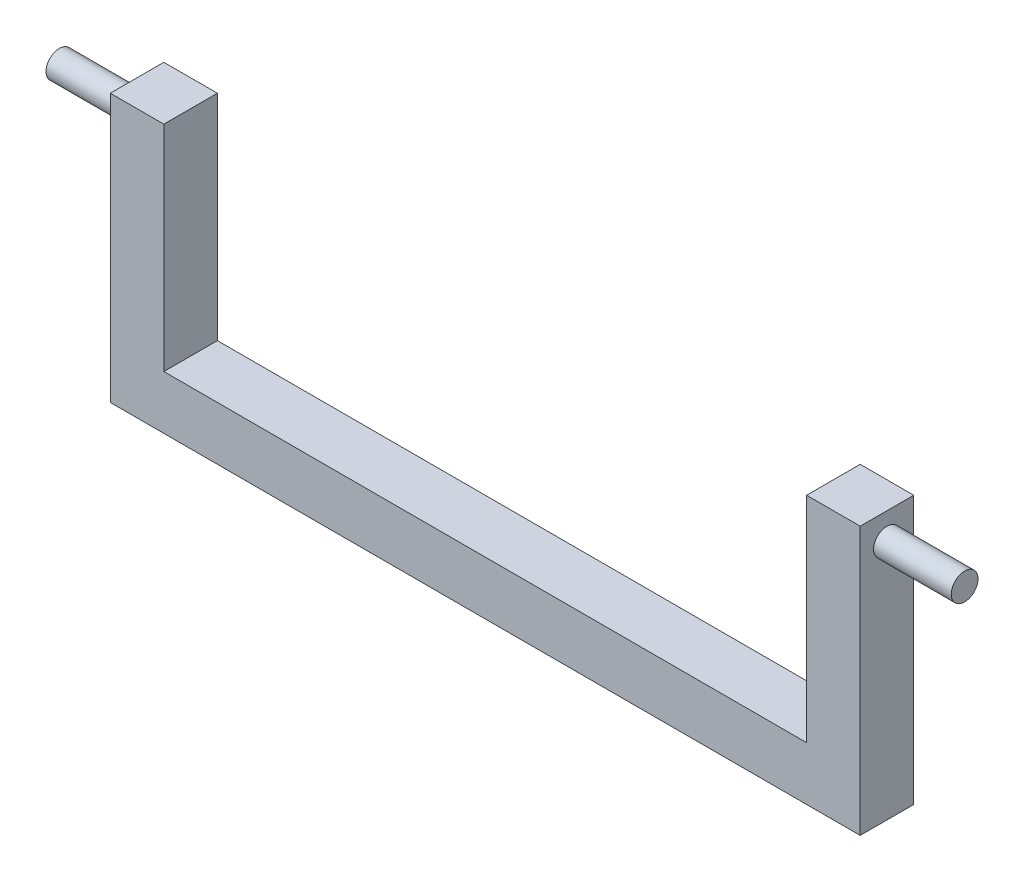
ISO-10303-21;
HEADER;
FILE_DESCRIPTION(('STEP AP214'),'2;1');
FILE_NAME('part.step','',(''),(''),'','','');
FILE_SCHEMA(('AUTOMOTIVE_DESIGN { 1 0 10303 214 1 1 1 1 }'));
ENDSEC;
DATA;
#1=APPLICATION_CONTEXT('core data for automotive mechanical design processes');
#2=APPLICATION_PROTOCOL_DEFINITION('international standard','automotive_design',2000,#1);
#3=PRODUCT_CONTEXT('',#1,'mechanical');
#4=PRODUCT('Part','Part','',(#3));
#5=PRODUCT_RELATED_PRODUCT_CATEGORY('part','',(#4));
#6=PRODUCT_DEFINITION_FORMATION('','',#4);
#7=PRODUCT_DEFINITION_CONTEXT('part definition',#1,'design');
#8=PRODUCT_DEFINITION('design','',#6,#7);
#9=PRODUCT_DEFINITION_SHAPE('','',#8);
#10=(LENGTH_UNIT() NAMED_UNIT(*) SI_UNIT(.MILLI.,.METRE.));
#11=(NAMED_UNIT(*) PLANE_ANGLE_UNIT() SI_UNIT($,.RADIAN.));
#12=(NAMED_UNIT(*) SI_UNIT($,.STERADIAN.) SOLID_ANGLE_UNIT());
#13=UNCERTAINTY_MEASURE_WITH_UNIT(LENGTH_MEASURE(1.E-05),#10,'distance_accuracy_value','');
#14=(GEOMETRIC_REPRESENTATION_CONTEXT(3) GLOBAL_UNCERTAINTY_ASSIGNED_CONTEXT((#13)) GLOBAL_UNIT_ASSIGNED_CONTEXT((#10,
#11,#12)) REPRESENTATION_CONTEXT('',''));
#15=CARTESIAN_POINT('',(0.,0.,0.));
#16=DIRECTION('',(0.,0.,1.));
#17=DIRECTION('',(1.,0.,0.));
#18=AXIS2_PLACEMENT_3D('',#15,#16,#17);
#19=CARTESIAN_POINT('',(-70.,52.,195.));
#20=DIRECTION('',(1.,0.,0.));
#21=DIRECTION('',(0.,0.,-1.));
#22=AXIS2_PLACEMENT_3D('',#19,#20,#21);
#23=PLANE('',#22);
#24=CARTESIAN_POINT('',(-70.,47.,190.));
#25=DIRECTION('',(1.,0.,0.));
#26=DIRECTION('',(0.,0.,-1.));
#27=AXIS2_PLACEMENT_3D('',#24,#25,#26);
#28=CIRCLE('',#27,2.5);
#29=CARTESIAN_POINT('',(-70.,47.,192.5));
#30=VERTEX_POINT('',#29);
#31=EDGE_CURVE('E45',#30,#30,#28,.F.);
#32=ORIENTED_EDGE('',*,*,#31,.F.);
#33=EDGE_LOOP('',(#32));
#34=FACE_BOUND('',#33,.T.);
#35=DIRECTION('',(0.,-1.,0.));
#36=VECTOR('',#35,1.);
#37=CARTESIAN_POINT('',(-70.,52.,185.));
#38=LINE('',#37,#36);
#39=CARTESIAN_POINT('',(-70.,52.,185.));
#40=VERTEX_POINT('',#39);
#41=CARTESIAN_POINT('',(-70.,2.,185.));
#42=VERTEX_POINT('',#41);
#43=EDGE_CURVE('E134',#40,#42,#38,.T.);
#44=ORIENTED_EDGE('',*,*,#43,.T.);
#45=DIRECTION('',(0.,0.,-1.));
#46=VECTOR('',#45,1.);
#47=CARTESIAN_POINT('',(-70.,2.,195.));
#48=LINE('',#47,#46);
#49=CARTESIAN_POINT('',(-70.,2.,195.));
#50=VERTEX_POINT('',#49);
#51=EDGE_CURVE('E162',#50,#42,#48,.T.);
#52=ORIENTED_EDGE('',*,*,#51,.F.);
#53=DIRECTION('',(0.,-1.,0.));
#54=VECTOR('',#53,1.);
#55=CARTESIAN_POINT('',(-70.,52.,195.));
#56=LINE('',#55,#54);
#57=CARTESIAN_POINT('',(-70.,52.,195.));
#58=VERTEX_POINT('',#57);
#59=EDGE_CURVE('E149',#58,#50,#56,.T.);
#60=ORIENTED_EDGE('',*,*,#59,.F.);
#61=DIRECTION('',(0.,0.,-1.));
#62=VECTOR('',#61,1.);
#63=CARTESIAN_POINT('',(-70.,52.,195.));
#64=LINE('',#63,#62);
#65=EDGE_CURVE('E130',#58,#40,#64,.T.);
#66=ORIENTED_EDGE('',*,*,#65,.T.);
#67=EDGE_LOOP('',(#44,#52,#60,#66));
#68=FACE_BOUND('',#67,.T.);
#69=ADVANCED_FACE('F37',(#34,#68),#23,.F.);
#70=CARTESIAN_POINT('',(-70.,2.,195.));
#71=DIRECTION('',(0.,1.,0.));
#72=DIRECTION('',(0.,0.,1.));
#73=AXIS2_PLACEMENT_3D('',#70,#71,#72);
#74=PLANE('',#73);
#75=DIRECTION('',(1.,0.,0.));
#76=VECTOR('',#75,1.);
#77=CARTESIAN_POINT('',(-70.,2.,185.));
#78=LINE('',#77,#76);
#79=CARTESIAN_POINT('',(70.,2.,185.));
#80=VERTEX_POINT('',#79);
#81=EDGE_CURVE('E137',#42,#80,#78,.T.);
#82=ORIENTED_EDGE('',*,*,#81,.T.);
#83=DIRECTION('',(0.,0.,-1.));
#84=VECTOR('',#83,1.);
#85=CARTESIAN_POINT('',(70.,2.,195.));
#86=LINE('',#85,#84);
#87=CARTESIAN_POINT('',(70.,2.,195.));
#88=VERTEX_POINT('',#87);
#89=EDGE_CURVE('E159',#88,#80,#86,.T.);
#90=ORIENTED_EDGE('',*,*,#89,.F.);
#91=DIRECTION('',(1.,0.,0.));
#92=VECTOR('',#91,1.);
#93=CARTESIAN_POINT('',(-70.,2.,195.));
#94=LINE('',#93,#92);
#95=EDGE_CURVE('E97',#50,#88,#94,.T.);
#96=ORIENTED_EDGE('',*,*,#95,.F.);
#97=ORIENTED_EDGE('',*,*,#51,.T.);
#98=EDGE_LOOP('',(#82,#90,#96,#97));
#99=FACE_BOUND('',#98,.T.);
#100=ADVANCED_FACE('F171',(#99),#74,.F.);
#101=CARTESIAN_POINT('',(70.,2.,195.));
#102=DIRECTION('',(-1.,0.,0.));
#103=DIRECTION('',(0.,0.,1.));
#104=AXIS2_PLACEMENT_3D('',#101,#102,#103);
#105=PLANE('',#104);
#106=CARTESIAN_POINT('',(70.,47.,190.));
#107=DIRECTION('',(-1.,0.,0.));
#108=DIRECTION('',(0.,0.,1.));
#109=AXIS2_PLACEMENT_3D('',#106,#107,#108);
#110=CIRCLE('',#109,2.5);
#111=CARTESIAN_POINT('',(70.,47.,192.5));
#112=VERTEX_POINT('',#111);
#113=EDGE_CURVE('E11',#112,#112,#110,.F.);
#114=ORIENTED_EDGE('',*,*,#113,.F.);
#115=EDGE_LOOP('',(#114));
#116=FACE_BOUND('',#115,.T.);
#117=DIRECTION('',(0.,1.,0.));
#118=VECTOR('',#117,1.);
#119=CARTESIAN_POINT('',(70.,2.,185.));
#120=LINE('',#119,#118);
#121=CARTESIAN_POINT('',(70.,52.,185.));
#122=VERTEX_POINT('',#121);
#123=EDGE_CURVE('E140',#80,#122,#120,.T.);
#124=ORIENTED_EDGE('',*,*,#123,.T.);
#125=DIRECTION('',(0.,0.,-1.));
#126=VECTOR('',#125,1.);
#127=CARTESIAN_POINT('',(70.,52.,195.));
#128=LINE('',#127,#126);
#129=CARTESIAN_POINT('',(70.,52.,195.));
#130=VERTEX_POINT('',#129);
#131=EDGE_CURVE('E156',#130,#122,#128,.T.);
#132=ORIENTED_EDGE('',*,*,#131,.F.);
#133=DIRECTION('',(0.,1.,0.));
#134=VECTOR('',#133,1.);
#135=CARTESIAN_POINT('',(70.,2.,195.));
#136=LINE('',#135,#134);
#137=EDGE_CURVE('E230',#88,#130,#136,.T.);
#138=ORIENTED_EDGE('',*,*,#137,.F.);
#139=ORIENTED_EDGE('',*,*,#89,.T.);
#140=EDGE_LOOP('',(#124,#132,#138,#139));
#141=FACE_BOUND('',#140,.T.);
#142=ADVANCED_FACE('F180',(#116,#141),#105,.F.);
#143=CARTESIAN_POINT('',(70.,52.,195.));
#144=DIRECTION('',(0.,-1.,0.));
#145=DIRECTION('',(0.,0.,-1.));
#146=AXIS2_PLACEMENT_3D('',#143,#144,#145);
#147=PLANE('',#146);
#148=DIRECTION('',(-1.,0.,0.));
#149=VECTOR('',#148,1.);
#150=CARTESIAN_POINT('',(70.,52.,185.));
#151=LINE('',#150,#149);
#152=CARTESIAN_POINT('',(60.,52.,185.));
#153=VERTEX_POINT('',#152);
#154=EDGE_CURVE('E142',#122,#153,#151,.T.);
#155=ORIENTED_EDGE('',*,*,#154,.T.);
#156=DIRECTION('',(0.,0.,-1.));
#157=VECTOR('',#156,1.);
#158=CARTESIAN_POINT('',(60.,52.,195.));
#159=LINE('',#158,#157);
#160=CARTESIAN_POINT('',(60.,52.,195.));
#161=VERTEX_POINT('',#160);
#162=EDGE_CURVE('E153',#161,#153,#159,.T.);
#163=ORIENTED_EDGE('',*,*,#162,.F.);
#164=DIRECTION('',(-1.,0.,0.));
#165=VECTOR('',#164,1.);
#166=CARTESIAN_POINT('',(70.,52.,195.));
#167=LINE('',#166,#165);
#168=EDGE_CURVE('E232',#130,#161,#167,.T.);
#169=ORIENTED_EDGE('',*,*,#168,.F.);
#170=ORIENTED_EDGE('',*,*,#131,.T.);
#171=EDGE_LOOP('',(#155,#163,#169,#170));
#172=FACE_BOUND('',#171,.T.);
#173=ADVANCED_FACE('F184',(#172),#147,.F.);
#174=CARTESIAN_POINT('',(60.,52.,195.));
#175=DIRECTION('',(1.,0.,0.));
#176=DIRECTION('',(0.,0.,-1.));
#177=AXIS2_PLACEMENT_3D('',#174,#175,#176);
#178=PLANE('',#177);
#179=DIRECTION('',(0.,-1.,0.));
#180=VECTOR('',#179,1.);
#181=CARTESIAN_POINT('',(60.,52.,185.));
#182=LINE('',#181,#180);
#183=CARTESIAN_POINT('',(60.,12.,185.));
#184=VERTEX_POINT('',#183);
#185=EDGE_CURVE('E144',#153,#184,#182,.T.);
#186=ORIENTED_EDGE('',*,*,#185,.T.);
#187=DIRECTION('',(0.,0.,-1.));
#188=VECTOR('',#187,1.);
#189=CARTESIAN_POINT('',(60.,12.,195.));
#190=LINE('',#189,#188);
#191=CARTESIAN_POINT('',(60.,12.,195.));
#192=VERTEX_POINT('',#191);
#193=EDGE_CURVE('E125',#192,#184,#190,.T.);
#194=ORIENTED_EDGE('',*,*,#193,.F.);
#195=DIRECTION('',(0.,-1.,0.));
#196=VECTOR('',#195,1.);
#197=CARTESIAN_POINT('',(60.,52.,195.));
#198=LINE('',#197,#196);
#199=EDGE_CURVE('E116',#161,#192,#198,.T.);
#200=ORIENTED_EDGE('',*,*,#199,.F.);
#201=ORIENTED_EDGE('',*,*,#162,.T.);
#202=EDGE_LOOP('',(#186,#194,#200,#201));
#203=FACE_BOUND('',#202,.T.);
#204=ADVANCED_FACE('F190',(#203),#178,.F.);
#205=CARTESIAN_POINT('',(60.,12.,195.));
#206=DIRECTION('',(0.,-1.,0.));
#207=DIRECTION('',(0.,0.,-1.));
#208=AXIS2_PLACEMENT_3D('',#205,#206,#207);
#209=PLANE('',#208);
#210=DIRECTION('',(-1.,0.,0.));
#211=VECTOR('',#210,1.);
#212=CARTESIAN_POINT('',(60.,12.,185.));
#213=LINE('',#212,#211);
#214=CARTESIAN_POINT('',(-60.,12.,185.));
#215=VERTEX_POINT('',#214);
#216=EDGE_CURVE('E124',#184,#215,#213,.T.);
#217=ORIENTED_EDGE('',*,*,#216,.T.);
#218=DIRECTION('',(0.,0.,-1.));
#219=VECTOR('',#218,1.);
#220=CARTESIAN_POINT('',(-60.,12.,195.));
#221=LINE('',#220,#219);
#222=CARTESIAN_POINT('',(-60.,12.,195.));
#223=VERTEX_POINT('',#222);
#224=EDGE_CURVE('E121',#223,#215,#221,.T.);
#225=ORIENTED_EDGE('',*,*,#224,.F.);
#226=DIRECTION('',(-1.,0.,0.));
#227=VECTOR('',#226,1.);
#228=CARTESIAN_POINT('',(60.,12.,195.));
#229=LINE('',#228,#227);
#230=EDGE_CURVE('E110',#192,#223,#229,.T.);
#231=ORIENTED_EDGE('',*,*,#230,.F.);
#232=ORIENTED_EDGE('',*,*,#193,.T.);
#233=EDGE_LOOP('',(#217,#225,#231,#232));
#234=FACE_BOUND('',#233,.T.);
#235=ADVANCED_FACE('F122',(#234),#209,.F.);
#236=CARTESIAN_POINT('',(-60.,12.,195.));
#237=DIRECTION('',(-1.,0.,0.));
#238=DIRECTION('',(0.,0.,1.));
#239=AXIS2_PLACEMENT_3D('',#236,#237,#238);
#240=PLANE('',#239);
#241=DIRECTION('',(0.,1.,0.));
#242=VECTOR('',#241,1.);
#243=CARTESIAN_POINT('',(-60.,12.,185.));
#244=LINE('',#243,#242);
#245=CARTESIAN_POINT('',(-60.,52.,185.));
#246=VERTEX_POINT('',#245);
#247=EDGE_CURVE('E82',#215,#246,#244,.T.);
#248=ORIENTED_EDGE('',*,*,#247,.T.);
#249=DIRECTION('',(0.,0.,-1.));
#250=VECTOR('',#249,1.);
#251=CARTESIAN_POINT('',(-60.,52.,195.));
#252=LINE('',#251,#250);
#253=CARTESIAN_POINT('',(-60.,52.,195.));
#254=VERTEX_POINT('',#253);
#255=EDGE_CURVE('E126',#254,#246,#252,.T.);
#256=ORIENTED_EDGE('',*,*,#255,.F.);
#257=DIRECTION('',(0.,1.,0.));
#258=VECTOR('',#257,1.);
#259=CARTESIAN_POINT('',(-60.,12.,195.));
#260=LINE('',#259,#258);
#261=EDGE_CURVE('E114',#223,#254,#260,.T.);
#262=ORIENTED_EDGE('',*,*,#261,.F.);
#263=ORIENTED_EDGE('',*,*,#224,.T.);
#264=EDGE_LOOP('',(#248,#256,#262,#263));
#265=FACE_BOUND('',#264,.T.);
#266=ADVANCED_FACE('F128',(#265),#240,.F.);
#267=CARTESIAN_POINT('',(-60.,52.,195.));
#268=DIRECTION('',(0.,-1.,0.));
#269=DIRECTION('',(0.,0.,-1.));
#270=AXIS2_PLACEMENT_3D('',#267,#268,#269);
#271=PLANE('',#270);
#272=DIRECTION('',(-1.,0.,0.));
#273=VECTOR('',#272,1.);
#274=CARTESIAN_POINT('',(-60.,52.,185.));
#275=LINE('',#274,#273);
#276=EDGE_CURVE('E88',#246,#40,#275,.T.);
#277=ORIENTED_EDGE('',*,*,#276,.T.);
#278=ORIENTED_EDGE('',*,*,#65,.F.);
#279=DIRECTION('',(-1.,0.,0.));
#280=VECTOR('',#279,1.);
#281=CARTESIAN_POINT('',(-60.,52.,195.));
#282=LINE('',#281,#280);
#283=EDGE_CURVE('E53',#254,#58,#282,.T.);
#284=ORIENTED_EDGE('',*,*,#283,.F.);
#285=ORIENTED_EDGE('',*,*,#255,.T.);
#286=EDGE_LOOP('',(#277,#278,#284,#285));
#287=FACE_BOUND('',#286,.T.);
#288=ADVANCED_FACE('F199',(#287),#271,.F.);
#289=CARTESIAN_POINT('',(0.,0.,195.));
#290=DIRECTION('',(0.,0.,1.));
#291=DIRECTION('',(1.,0.,0.));
#292=AXIS2_PLACEMENT_3D('',#289,#290,#291);
#293=PLANE('',#292);
#294=ORIENTED_EDGE('',*,*,#59,.T.);
#295=ORIENTED_EDGE('',*,*,#95,.T.);
#296=ORIENTED_EDGE('',*,*,#137,.T.);
#297=ORIENTED_EDGE('',*,*,#168,.T.);
#298=ORIENTED_EDGE('',*,*,#199,.T.);
#299=ORIENTED_EDGE('',*,*,#230,.T.);
#300=ORIENTED_EDGE('',*,*,#261,.T.);
#301=ORIENTED_EDGE('',*,*,#283,.T.);
#302=EDGE_LOOP('',(#294,#295,#296,#297,#298,#299,#300,#301));
#303=FACE_BOUND('',#302,.T.);
#304=ADVANCED_FACE('F112',(#303),#293,.T.);
#305=CARTESIAN_POINT('',(0.,0.,185.));
#306=DIRECTION('',(0.,0.,1.));
#307=DIRECTION('',(1.,0.,0.));
#308=AXIS2_PLACEMENT_3D('',#305,#306,#307);
#309=PLANE('',#308);
#310=ORIENTED_EDGE('',*,*,#43,.F.);
#311=ORIENTED_EDGE('',*,*,#276,.F.);
#312=ORIENTED_EDGE('',*,*,#247,.F.);
#313=ORIENTED_EDGE('',*,*,#216,.F.);
#314=ORIENTED_EDGE('',*,*,#185,.F.);
#315=ORIENTED_EDGE('',*,*,#154,.F.);
#316=ORIENTED_EDGE('',*,*,#123,.F.);
#317=ORIENTED_EDGE('',*,*,#81,.F.);
#318=EDGE_LOOP('',(#310,#311,#312,#313,#314,#315,#316,#317));
#319=FACE_BOUND('',#318,.T.);
#320=ADVANCED_FACE('F176',(#319),#309,.F.);
#321=CARTESIAN_POINT('',(-70.,47.,190.));
#322=DIRECTION('',(-1.,0.,0.));
#323=DIRECTION('',(0.,0.,1.));
#324=AXIS2_PLACEMENT_3D('',#321,#322,#323);
#325=CYLINDRICAL_SURFACE('',#324,2.5);
#326=CARTESIAN_POINT('',(-84.5,47.,190.));
#327=DIRECTION('',(1.,0.,0.));
#328=DIRECTION('',(0.,0.,-1.));
#329=AXIS2_PLACEMENT_3D('',#326,#327,#328);
#330=CIRCLE('',#329,2.5);
#331=CARTESIAN_POINT('',(-84.5,47.,192.5));
#332=VERTEX_POINT('',#331);
#333=EDGE_CURVE('E138',#332,#332,#330,.T.);
#334=CARTESIAN_POINT('',(-70.,47.,192.5));
#335=CARTESIAN_POINT('',(-70.1510416666667,47.,192.5));
#336=CARTESIAN_POINT('',(-70.3020833333333,47.,192.5));
#337=CARTESIAN_POINT('',(-70.6041666666667,47.,192.5));
#338=CARTESIAN_POINT('',(-70.7552083333333,47.,192.5));
#339=CARTESIAN_POINT('',(-71.0572916666667,47.,192.5));
#340=CARTESIAN_POINT('',(-71.2083333333333,47.,192.5));
#341=CARTESIAN_POINT('',(-71.5104166666667,47.,192.5));
#342=CARTESIAN_POINT('',(-71.6614583333333,47.,192.5));
#343=CARTESIAN_POINT('',(-71.9635416666667,47.,192.5));
#344=CARTESIAN_POINT('',(-72.1145833333333,47.,192.5));
#345=CARTESIAN_POINT('',(-72.4166666666667,47.,192.5));
#346=CARTESIAN_POINT('',(-72.5677083333333,47.,192.5));
#347=CARTESIAN_POINT('',(-72.8697916666667,47.,192.5));
#348=CARTESIAN_POINT('',(-73.0208333333333,47.,192.5));
#349=CARTESIAN_POINT('',(-73.3229166666667,47.,192.5));
#350=CARTESIAN_POINT('',(-73.4739583333333,47.,192.5));
#351=CARTESIAN_POINT('',(-73.7760416666667,47.,192.5));
#352=CARTESIAN_POINT('',(-73.9270833333333,47.,192.5));
#353=CARTESIAN_POINT('',(-74.2291666666667,47.,192.5));
#354=CARTESIAN_POINT('',(-74.3802083333333,47.,192.5));
#355=CARTESIAN_POINT('',(-74.6822916666667,47.,192.5));
#356=CARTESIAN_POINT('',(-74.8333333333333,47.,192.5));
#357=CARTESIAN_POINT('',(-75.1354166666667,47.,192.5));
#358=CARTESIAN_POINT('',(-75.2864583333333,47.,192.5));
#359=CARTESIAN_POINT('',(-75.5885416666667,47.,192.5));
#360=CARTESIAN_POINT('',(-75.7395833333333,47.,192.5));
#361=CARTESIAN_POINT('',(-76.0416666666667,47.,192.5));
#362=CARTESIAN_POINT('',(-76.1927083333333,47.,192.5));
#363=CARTESIAN_POINT('',(-76.4947916666667,47.,192.5));
#364=CARTESIAN_POINT('',(-76.6458333333333,47.,192.5));
#365=CARTESIAN_POINT('',(-76.9479166666667,47.,192.5));
#366=CARTESIAN_POINT('',(-77.0989583333333,47.,192.5));
#367=CARTESIAN_POINT('',(-77.4010416666667,47.,192.5));
#368=CARTESIAN_POINT('',(-77.5520833333333,47.,192.5));
#369=CARTESIAN_POINT('',(-77.8541666666667,47.,192.5));
#370=CARTESIAN_POINT('',(-78.0052083333333,47.,192.5));
#371=CARTESIAN_POINT('',(-78.3072916666667,47.,192.5));
#372=CARTESIAN_POINT('',(-78.4583333333333,47.,192.5));
#373=CARTESIAN_POINT('',(-78.7604166666667,47.,192.5));
#374=CARTESIAN_POINT('',(-78.9114583333333,47.,192.5));
#375=CARTESIAN_POINT('',(-79.2135416666667,47.,192.5));
#376=CARTESIAN_POINT('',(-79.3645833333333,47.,192.5));
#377=CARTESIAN_POINT('',(-79.6666666666667,47.,192.5));
#378=CARTESIAN_POINT('',(-79.8177083333333,47.,192.5));
#379=CARTESIAN_POINT('',(-80.1197916666667,47.,192.5));
#380=CARTESIAN_POINT('',(-80.2708333333333,47.,192.5));
#381=CARTESIAN_POINT('',(-80.5729166666667,47.,192.5));
#382=CARTESIAN_POINT('',(-80.7239583333333,47.,192.5));
#383=CARTESIAN_POINT('',(-81.0260416666667,47.,192.5));
#384=CARTESIAN_POINT('',(-81.1770833333333,47.,192.5));
#385=CARTESIAN_POINT('',(-81.4791666666667,47.,192.5));
#386=CARTESIAN_POINT('',(-81.6302083333333,47.,192.5));
#387=CARTESIAN_POINT('',(-81.9322916666667,47.,192.5));
#388=CARTESIAN_POINT('',(-82.0833333333333,47.,192.5));
#389=CARTESIAN_POINT('',(-82.3854166666667,47.,192.5));
#390=CARTESIAN_POINT('',(-82.5364583333333,47.,192.5));
#391=CARTESIAN_POINT('',(-82.8385416666667,47.,192.5));
#392=CARTESIAN_POINT('',(-82.9895833333333,47.,192.5));
#393=CARTESIAN_POINT('',(-83.2916666666667,47.,192.5));
#394=CARTESIAN_POINT('',(-83.4427083333333,47.,192.5));
#395=CARTESIAN_POINT('',(-83.7447916666667,47.,192.5));
#396=CARTESIAN_POINT('',(-83.8958333333333,47.,192.5));
#397=CARTESIAN_POINT('',(-84.1979166666667,47.,192.5));
#398=CARTESIAN_POINT('',(-84.3489583333333,47.,192.5));
#399=CARTESIAN_POINT('',(-84.5,47.,192.5));
#400=B_SPLINE_CURVE_WITH_KNOTS('',3,(#334,#335,#336,#337,#338,#339,#340,#341,#342,#343,#344,
#345,#346,#347,#348,#349,#350,#351,#352,#353,#354,#355,#356,#357,#358,#359,#360,#361,#362,#363,
#364,#365,#366,#367,#368,#369,#370,#371,#372,#373,#374,#375,#376,#377,#378,#379,#380,#381,#382,
#383,#384,#385,#386,#387,#388,#389,#390,#391,#392,#393,#394,#395,#396,#397,#398,#399),
.UNSPECIFIED.,.F.,.F.,(4,2,2,2,2,2,2,2,2,2,2,2,2,2,2,2,2,2,2,2,2,2,2,2,2,2,2,2,2,2,2,2,4),(0.,
0.453125000000013,0.906250000000011,1.35937500000001,1.81250000000001,2.26562500000001,
2.71875000000001,3.171875,3.625,4.078125,4.53125,4.984375,5.43750000000001,5.89062500000001,
6.34375000000001,6.79687500000001,7.25000000000001,7.70312500000001,8.15625,8.609375,9.0625,
9.515625,9.96875,10.421875,10.875,11.328125,11.78125,12.234375,12.6875,13.140625,13.59375,
14.046875,14.5),.UNSPECIFIED.);
#401=EDGE_CURVE('BSEAM166',#30,#332,#400,.T.);
#402=ORIENTED_EDGE('',*,*,#31,.T.);
#403=ORIENTED_EDGE('',*,*,#333,.T.);
#404=ORIENTED_EDGE('',*,*,#401,.T.);
#405=ORIENTED_EDGE('',*,*,#401,.F.);
#406=EDGE_LOOP('',(#402,#404,#403,#405));
#407=FACE_BOUND('',#406,.T.);
#408=ADVANCED_FACE('F166',(#407),#325,.T.);
#409=CARTESIAN_POINT('',(-84.5,47.,190.));
#410=DIRECTION('',(1.,0.,0.));
#411=DIRECTION('',(0.,0.,-1.));
#412=AXIS2_PLACEMENT_3D('',#409,#410,#411);
#413=PLANE('',#412);
#414=ORIENTED_EDGE('',*,*,#333,.F.);
#415=EDGE_LOOP('',(#414));
#416=FACE_BOUND('',#415,.T.);
#417=ADVANCED_FACE('F208',(#416),#413,.F.);
#418=CARTESIAN_POINT('',(84.5,47.,190.));
#419=DIRECTION('',(-1.,0.,0.));
#420=DIRECTION('',(0.,0.,1.));
#421=AXIS2_PLACEMENT_3D('',#418,#419,#420);
#422=CYLINDRICAL_SURFACE('',#421,2.5);
#423=CARTESIAN_POINT('',(84.5,47.,190.));
#424=DIRECTION('',(1.,0.,0.));
#425=DIRECTION('',(0.,0.,-1.));
#426=AXIS2_PLACEMENT_3D('',#423,#424,#425);
#427=CIRCLE('',#426,2.5);
#428=CARTESIAN_POINT('',(84.5,47.,192.5));
#429=VERTEX_POINT('',#428);
#430=EDGE_CURVE('E223',#429,#429,#427,.T.);
#431=CARTESIAN_POINT('',(84.5,47.,192.5));
#432=CARTESIAN_POINT('',(84.3489583333333,47.,192.5));
#433=CARTESIAN_POINT('',(84.1979166666667,47.,192.5));
#434=CARTESIAN_POINT('',(83.8958333333333,47.,192.5));
#435=CARTESIAN_POINT('',(83.7447916666667,47.,192.5));
#436=CARTESIAN_POINT('',(83.4427083333333,47.,192.5));
#437=CARTESIAN_POINT('',(83.2916666666667,47.,192.5));
#438=CARTESIAN_POINT('',(82.9895833333333,47.,192.5));
#439=CARTESIAN_POINT('',(82.8385416666667,47.,192.5));
#440=CARTESIAN_POINT('',(82.5364583333333,47.,192.5));
#441=CARTESIAN_POINT('',(82.3854166666667,47.,192.5));
#442=CARTESIAN_POINT('',(82.0833333333333,47.,192.5));
#443=CARTESIAN_POINT('',(81.9322916666667,47.,192.5));
#444=CARTESIAN_POINT('',(81.6302083333333,47.,192.5));
#445=CARTESIAN_POINT('',(81.4791666666667,47.,192.5));
#446=CARTESIAN_POINT('',(81.1770833333333,47.,192.5));
#447=CARTESIAN_POINT('',(81.0260416666667,47.,192.5));
#448=CARTESIAN_POINT('',(80.7239583333333,47.,192.5));
#449=CARTESIAN_POINT('',(80.5729166666667,47.,192.5));
#450=CARTESIAN_POINT('',(80.2708333333333,47.,192.5));
#451=CARTESIAN_POINT('',(80.1197916666667,47.,192.5));
#452=CARTESIAN_POINT('',(79.8177083333333,47.,192.5));
#453=CARTESIAN_POINT('',(79.6666666666667,47.,192.5));
#454=CARTESIAN_POINT('',(79.3645833333333,47.,192.5));
#455=CARTESIAN_POINT('',(79.2135416666667,47.,192.5));
#456=CARTESIAN_POINT('',(78.9114583333333,47.,192.5));
#457=CARTESIAN_POINT('',(78.7604166666667,47.,192.5));
#458=CARTESIAN_POINT('',(78.4583333333333,47.,192.5));
#459=CARTESIAN_POINT('',(78.3072916666667,47.,192.5));
#460=CARTESIAN_POINT('',(78.0052083333333,47.,192.5));
#461=CARTESIAN_POINT('',(77.8541666666667,47.,192.5));
#462=CARTESIAN_POINT('',(77.5520833333333,47.,192.5));
#463=CARTESIAN_POINT('',(77.4010416666667,47.,192.5));
#464=CARTESIAN_POINT('',(77.0989583333333,47.,192.5));
#465=CARTESIAN_POINT('',(76.9479166666667,47.,192.5));
#466=CARTESIAN_POINT('',(76.6458333333333,47.,192.5));
#467=CARTESIAN_POINT('',(76.4947916666667,47.,192.5));
#468=CARTESIAN_POINT('',(76.1927083333333,47.,192.5));
#469=CARTESIAN_POINT('',(76.0416666666667,47.,192.5));
#470=CARTESIAN_POINT('',(75.7395833333333,47.,192.5));
#471=CARTESIAN_POINT('',(75.5885416666667,47.,192.5));
#472=CARTESIAN_POINT('',(75.2864583333333,47.,192.5));
#473=CARTESIAN_POINT('',(75.1354166666667,47.,192.5));
#474=CARTESIAN_POINT('',(74.8333333333333,47.,192.5));
#475=CARTESIAN_POINT('',(74.6822916666667,47.,192.5));
#476=CARTESIAN_POINT('',(74.3802083333333,47.,192.5));
#477=CARTESIAN_POINT('',(74.2291666666667,47.,192.5));
#478=CARTESIAN_POINT('',(73.9270833333333,47.,192.5));
#479=CARTESIAN_POINT('',(73.7760416666667,47.,192.5));
#480=CARTESIAN_POINT('',(73.4739583333333,47.,192.5));
#481=CARTESIAN_POINT('',(73.3229166666667,47.,192.5));
#482=CARTESIAN_POINT('',(73.0208333333333,47.,192.5));
#483=CARTESIAN_POINT('',(72.8697916666667,47.,192.5));
#484=CARTESIAN_POINT('',(72.5677083333333,47.,192.5));
#485=CARTESIAN_POINT('',(72.4166666666667,47.,192.5));
#486=CARTESIAN_POINT('',(72.1145833333333,47.,192.5));
#487=CARTESIAN_POINT('',(71.9635416666667,47.,192.5));
#488=CARTESIAN_POINT('',(71.6614583333333,47.,192.5));
#489=CARTESIAN_POINT('',(71.5104166666667,47.,192.5));
#490=CARTESIAN_POINT('',(71.2083333333333,47.,192.5));
#491=CARTESIAN_POINT('',(71.0572916666667,47.,192.5));
#492=CARTESIAN_POINT('',(70.7552083333333,47.,192.5));
#493=CARTESIAN_POINT('',(70.6041666666667,47.,192.5));
#494=CARTESIAN_POINT('',(70.3020833333333,47.,192.5));
#495=CARTESIAN_POINT('',(70.1510416666667,47.,192.5));
#496=CARTESIAN_POINT('',(70.,47.,192.5));
#497=B_SPLINE_CURVE_WITH_KNOTS('',3,(#431,#432,#433,#434,#435,#436,#437,#438,#439,#440,#441,
#442,#443,#444,#445,#446,#447,#448,#449,#450,#451,#452,#453,#454,#455,#456,#457,#458,#459,#460,
#461,#462,#463,#464,#465,#466,#467,#468,#469,#470,#471,#472,#473,#474,#475,#476,#477,#478,#479,
#480,#481,#482,#483,#484,#485,#486,#487,#488,#489,#490,#491,#492,#493,#494,#495,#496),
.UNSPECIFIED.,.F.,.F.,(4,2,2,2,2,2,2,2,2,2,2,2,2,2,2,2,2,2,2,2,2,2,2,2,2,2,2,2,2,2,2,2,4),(0.,
0.453125000000013,0.906250000000011,1.35937500000001,1.81250000000001,2.26562500000001,
2.71875000000001,3.171875,3.625,4.078125,4.53125,4.984375,5.4375,5.890625,6.34375,
6.79687499999999,7.24999999999999,7.70312499999999,8.15624999999999,8.60937499999999,
9.06249999999999,9.51562499999999,9.96874999999998,10.421875,10.875,11.328125,11.78125,
12.234375,12.6875,13.140625,13.59375,14.046875,14.5),.UNSPECIFIED.);
#498=EDGE_CURVE('BSEAM211',#429,#112,#497,.T.);
#499=ORIENTED_EDGE('',*,*,#430,.F.);
#500=ORIENTED_EDGE('',*,*,#113,.T.);
#501=ORIENTED_EDGE('',*,*,#498,.T.);
#502=ORIENTED_EDGE('',*,*,#498,.F.);
#503=EDGE_LOOP('',(#499,#501,#500,#502));
#504=FACE_BOUND('',#503,.T.);
#505=ADVANCED_FACE('F211',(#504),#422,.T.);
#506=CARTESIAN_POINT('',(84.5,47.,190.));
#507=DIRECTION('',(1.,0.,0.));
#508=DIRECTION('',(0.,0.,-1.));
#509=AXIS2_PLACEMENT_3D('',#506,#507,#508);
#510=PLANE('',#509);
#511=ORIENTED_EDGE('',*,*,#430,.T.);
#512=EDGE_LOOP('',(#511));
#513=FACE_BOUND('',#512,.T.);
#514=ADVANCED_FACE('F215',(#513),#510,.T.);
#515=CLOSED_SHELL('',(#69,#100,#142,#173,#204,#235,#266,#288,#304,#320,#408,#417,#505,#514));
#516=MANIFOLD_SOLID_BREP('B2',#515);
#517=ADVANCED_BREP_SHAPE_REPRESENTATION('',(#18,#516),#14);
#518=SHAPE_DEFINITION_REPRESENTATION(#9,#517);
ENDSEC;
END-ISO-10303-21;
